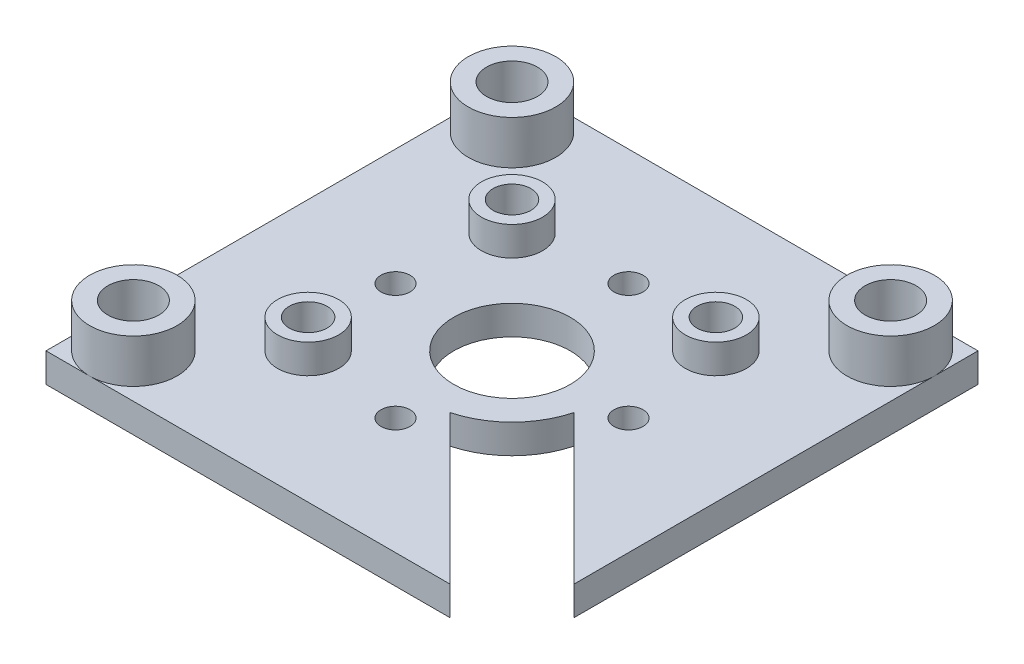
ISO-10303-21;
HEADER;
FILE_DESCRIPTION(('STEP AP214'),'2;1');
FILE_NAME('part.step','',(''),(''),'','','');
FILE_SCHEMA(('AUTOMOTIVE_DESIGN { 1 0 10303 214 1 1 1 1 }'));
ENDSEC;
DATA;
#1=APPLICATION_CONTEXT('core data for automotive mechanical design processes');
#2=APPLICATION_PROTOCOL_DEFINITION('international standard','automotive_design',2000,#1);
#3=PRODUCT_CONTEXT('',#1,'mechanical');
#4=PRODUCT('Part','Part','',(#3));
#5=PRODUCT_RELATED_PRODUCT_CATEGORY('part','',(#4));
#6=PRODUCT_DEFINITION_FORMATION('','',#4);
#7=PRODUCT_DEFINITION_CONTEXT('part definition',#1,'design');
#8=PRODUCT_DEFINITION('design','',#6,#7);
#9=PRODUCT_DEFINITION_SHAPE('','',#8);
#10=(LENGTH_UNIT() NAMED_UNIT(*) SI_UNIT(.MILLI.,.METRE.));
#11=(NAMED_UNIT(*) PLANE_ANGLE_UNIT() SI_UNIT($,.RADIAN.));
#12=(NAMED_UNIT(*) SI_UNIT($,.STERADIAN.) SOLID_ANGLE_UNIT());
#13=UNCERTAINTY_MEASURE_WITH_UNIT(LENGTH_MEASURE(1.E-05),#10,'distance_accuracy_value','');
#14=(GEOMETRIC_REPRESENTATION_CONTEXT(3) GLOBAL_UNCERTAINTY_ASSIGNED_CONTEXT((#13)) GLOBAL_UNIT_ASSIGNED_CONTEXT((#10,
#11,#12)) REPRESENTATION_CONTEXT('',''));
#15=CARTESIAN_POINT('',(0.,0.,0.));
#16=DIRECTION('',(0.,0.,1.));
#17=DIRECTION('',(1.,0.,0.));
#18=AXIS2_PLACEMENT_3D('',#15,#16,#17);
#19=CARTESIAN_POINT('',(0.,2.,0.));
#20=DIRECTION('',(0.,1.,0.));
#21=DIRECTION('',(0.,0.,1.));
#22=AXIS2_PLACEMENT_3D('',#19,#20,#21);
#23=PLANE('',#22);
#24=CARTESIAN_POINT('',(-13.,2.,13.));
#25=DIRECTION('',(0.,1.,0.));
#26=DIRECTION('',(0.,0.,1.));
#27=AXIS2_PLACEMENT_3D('',#24,#25,#26);
#28=CIRCLE('',#27,3.);
#29=CARTESIAN_POINT('',(-13.,2.,16.));
#30=VERTEX_POINT('',#29);
#31=CARTESIAN_POINT('',(-16.,2.,13.));
#32=VERTEX_POINT('',#31);
#33=EDGE_CURVE('E11',#30,#32,#28,.T.);
#34=ORIENTED_EDGE('',*,*,#33,.F.);
#35=DIRECTION('',(1.,0.,0.));
#36=VECTOR('',#35,1.);
#37=CARTESIAN_POINT('',(0.,2.,16.));
#38=LINE('',#37,#36);
#39=CARTESIAN_POINT('',(11.7573593128807,2.,16.));
#40=VERTEX_POINT('',#39);
#41=EDGE_CURVE('E179',#30,#40,#38,.T.);
#42=ORIENTED_EDGE('',*,*,#41,.T.);
#43=DIRECTION('',(0.707106781186548,0.,0.707106781186548));
#44=VECTOR('',#43,1.);
#45=CARTESIAN_POINT('',(-2.12132034355964,2.,2.12132034355964));
#46=LINE('',#45,#44);
#47=CARTESIAN_POINT('',(1.55291427061513,2.,5.79555495773441));
#48=VERTEX_POINT('',#47);
#49=EDGE_CURVE('E381',#48,#40,#46,.T.);
#50=ORIENTED_EDGE('',*,*,#49,.F.);
#51=CARTESIAN_POINT('',(0.,2.,0.));
#52=DIRECTION('',(0.,1.,0.));
#53=DIRECTION('',(0.,0.,1.));
#54=AXIS2_PLACEMENT_3D('',#51,#52,#53);
#55=CIRCLE('',#54,6.00000000000001);
#56=CARTESIAN_POINT('',(5.79555495773441,2.,1.55291427061513));
#57=VERTEX_POINT('',#56);
#58=EDGE_CURVE('E389',#57,#48,#55,.F.);
#59=ORIENTED_EDGE('',*,*,#58,.F.);
#60=DIRECTION('',(0.707106781186548,0.,0.707106781186548));
#61=VECTOR('',#60,1.);
#62=CARTESIAN_POINT('',(2.12132034355964,2.,-2.12132034355964));
#63=LINE('',#62,#61);
#64=CARTESIAN_POINT('',(16.,2.,11.7573593128807));
#65=VERTEX_POINT('',#64);
#66=EDGE_CURVE('E149',#57,#65,#63,.T.);
#67=ORIENTED_EDGE('',*,*,#66,.T.);
#68=DIRECTION('',(0.,0.,1.));
#69=VECTOR('',#68,1.);
#70=CARTESIAN_POINT('',(16.,2.,0.));
#71=LINE('',#70,#69);
#72=CARTESIAN_POINT('',(16.,2.,-13.));
#73=VERTEX_POINT('',#72);
#74=EDGE_CURVE('E130',#73,#65,#71,.T.);
#75=ORIENTED_EDGE('',*,*,#74,.F.);
#76=CARTESIAN_POINT('',(13.,2.,-13.));
#77=DIRECTION('',(0.,1.,0.));
#78=DIRECTION('',(0.,0.,1.));
#79=AXIS2_PLACEMENT_3D('',#76,#77,#78);
#80=CIRCLE('',#79,3.);
#81=CARTESIAN_POINT('',(13.,2.,-16.));
#82=VERTEX_POINT('',#81);
#83=EDGE_CURVE('E143',#82,#73,#80,.T.);
#84=ORIENTED_EDGE('',*,*,#83,.F.);
#85=DIRECTION('',(1.,0.,0.));
#86=VECTOR('',#85,1.);
#87=CARTESIAN_POINT('',(0.,2.,-16.));
#88=LINE('',#87,#86);
#89=CARTESIAN_POINT('',(-13.,2.,-16.));
#90=VERTEX_POINT('',#89);
#91=EDGE_CURVE('E750',#90,#82,#88,.T.);
#92=ORIENTED_EDGE('',*,*,#91,.F.);
#93=CARTESIAN_POINT('',(-13.,2.,-13.));
#94=DIRECTION('',(0.,1.,0.));
#95=DIRECTION('',(0.,0.,1.));
#96=AXIS2_PLACEMENT_3D('',#93,#94,#95);
#97=CIRCLE('',#96,3.);
#98=CARTESIAN_POINT('',(-16.,2.,-13.));
#99=VERTEX_POINT('',#98);
#100=EDGE_CURVE('E67',#99,#90,#97,.T.);
#101=ORIENTED_EDGE('',*,*,#100,.F.);
#102=DIRECTION('',(0.,0.,1.));
#103=VECTOR('',#102,1.);
#104=CARTESIAN_POINT('',(-16.,2.,0.));
#105=LINE('',#104,#103);
#106=EDGE_CURVE('E185',#99,#32,#105,.T.);
#107=ORIENTED_EDGE('',*,*,#106,.T.);
#108=EDGE_LOOP('',(#34,#42,#50,#59,#67,#75,#84,#92,#101,#107));
#109=FACE_BOUND('',#108,.T.);
#110=CARTESIAN_POINT('',(-6.99999999999999,2.,7.00000000000002));
#111=DIRECTION('',(0.,1.,0.));
#112=DIRECTION('',(0.,0.,1.));
#113=AXIS2_PLACEMENT_3D('',#110,#111,#112);
#114=CIRCLE('',#113,2.1);
#115=CARTESIAN_POINT('',(-6.99999999999999,2.,9.10000000000002));
#116=VERTEX_POINT('',#115);
#117=EDGE_CURVE('E163',#116,#116,#114,.T.);
#118=ORIENTED_EDGE('',*,*,#117,.F.);
#119=EDGE_LOOP('',(#118));
#120=FACE_BOUND('',#119,.T.);
#121=CARTESIAN_POINT('',(-7.00000000000001,2.,-6.99999999999999));
#122=DIRECTION('',(0.,1.,0.));
#123=DIRECTION('',(0.,0.,1.));
#124=AXIS2_PLACEMENT_3D('',#121,#122,#123);
#125=CIRCLE('',#124,2.1);
#126=CARTESIAN_POINT('',(-7.00000000000001,2.,-4.89999999999999));
#127=VERTEX_POINT('',#126);
#128=EDGE_CURVE('E165',#127,#127,#125,.T.);
#129=ORIENTED_EDGE('',*,*,#128,.F.);
#130=EDGE_LOOP('',(#129));
#131=FACE_BOUND('',#130,.T.);
#132=CARTESIAN_POINT('',(6.99999999999999,2.,-7.00000000000002));
#133=DIRECTION('',(0.,1.,0.));
#134=DIRECTION('',(0.,0.,1.));
#135=AXIS2_PLACEMENT_3D('',#132,#133,#134);
#136=CIRCLE('',#135,2.1);
#137=CARTESIAN_POINT('',(6.99999999999999,2.,-4.90000000000002));
#138=VERTEX_POINT('',#137);
#139=EDGE_CURVE('E252',#138,#138,#136,.T.);
#140=ORIENTED_EDGE('',*,*,#139,.F.);
#141=EDGE_LOOP('',(#140));
#142=FACE_BOUND('',#141,.T.);
#143=CARTESIAN_POINT('',(0.,2.,0.));
#144=DIRECTION('',(0.,1.,0.));
#145=DIRECTION('',(0.,0.,1.));
#146=AXIS2_PLACEMENT_3D('',#143,#144,#145);
#147=CIRCLE('',#146,4.);
#148=CARTESIAN_POINT('',(0.,2.,4.));
#149=VERTEX_POINT('',#148);
#150=EDGE_CURVE('E242',#149,#149,#147,.T.);
#151=ORIENTED_EDGE('',*,*,#150,.F.);
#152=EDGE_LOOP('',(#151));
#153=FACE_BOUND('',#152,.T.);
#154=CARTESIAN_POINT('',(0.,2.,-8.));
#155=DIRECTION('',(0.,1.,0.));
#156=DIRECTION('',(0.,0.,1.));
#157=AXIS2_PLACEMENT_3D('',#154,#155,#156);
#158=CIRCLE('',#157,1.);
#159=CARTESIAN_POINT('',(0.,2.,-7.));
#160=VERTEX_POINT('',#159);
#161=EDGE_CURVE('E268',#160,#160,#158,.T.);
#162=ORIENTED_EDGE('',*,*,#161,.F.);
#163=EDGE_LOOP('',(#162));
#164=FACE_BOUND('',#163,.T.);
#165=CARTESIAN_POINT('',(-8.,2.,0.));
#166=DIRECTION('',(0.,1.,0.));
#167=DIRECTION('',(0.,0.,1.));
#168=AXIS2_PLACEMENT_3D('',#165,#166,#167);
#169=CIRCLE('',#168,1.);
#170=CARTESIAN_POINT('',(-8.,2.,0.999999999999944));
#171=VERTEX_POINT('',#170);
#172=EDGE_CURVE('E271',#171,#171,#169,.T.);
#173=ORIENTED_EDGE('',*,*,#172,.F.);
#174=EDGE_LOOP('',(#173));
#175=FACE_BOUND('',#174,.T.);
#176=CARTESIAN_POINT('',(0.,2.,8.));
#177=DIRECTION('',(0.,1.,0.));
#178=DIRECTION('',(0.,0.,1.));
#179=AXIS2_PLACEMENT_3D('',#176,#177,#178);
#180=CIRCLE('',#179,1.);
#181=CARTESIAN_POINT('',(0.,2.,9.));
#182=VERTEX_POINT('',#181);
#183=EDGE_CURVE('E277',#182,#182,#180,.T.);
#184=ORIENTED_EDGE('',*,*,#183,.F.);
#185=EDGE_LOOP('',(#184));
#186=FACE_BOUND('',#185,.T.);
#187=CARTESIAN_POINT('',(8.,2.,0.));
#188=DIRECTION('',(0.,1.,0.));
#189=DIRECTION('',(0.,0.,1.));
#190=AXIS2_PLACEMENT_3D('',#187,#188,#189);
#191=CIRCLE('',#190,1.);
#192=CARTESIAN_POINT('',(8.,2.,1.));
#193=VERTEX_POINT('',#192);
#194=EDGE_CURVE('E150',#193,#193,#191,.T.);
#195=ORIENTED_EDGE('',*,*,#194,.F.);
#196=EDGE_LOOP('',(#195));
#197=FACE_BOUND('',#196,.T.);
#198=ADVANCED_FACE('F50',(#109,#120,#131,#142,#153,#164,#175,#186,#197),#23,.T.);
#199=EDGE_CURVE('E169',#90,#99,#97,.T.);
#200=ORIENTED_EDGE('',*,*,#199,.F.);
#201=CARTESIAN_POINT('',(-16.,2.,-16.));
#202=VERTEX_POINT('',#201);
#203=EDGE_CURVE('E192',#202,#90,#88,.T.);
#204=ORIENTED_EDGE('',*,*,#203,.F.);
#205=EDGE_CURVE('E190',#202,#99,#105,.T.);
#206=ORIENTED_EDGE('',*,*,#205,.T.);
#207=EDGE_LOOP('',(#200,#204,#206));
#208=FACE_BOUND('',#207,.T.);
#209=ADVANCED_FACE('F288',(#208),#23,.T.);
#210=EDGE_CURVE('E151',#73,#82,#80,.T.);
#211=ORIENTED_EDGE('',*,*,#210,.F.);
#212=CARTESIAN_POINT('',(16.,2.,-16.));
#213=VERTEX_POINT('',#212);
#214=EDGE_CURVE('E126',#213,#73,#71,.T.);
#215=ORIENTED_EDGE('',*,*,#214,.F.);
#216=EDGE_CURVE('E138',#82,#213,#88,.T.);
#217=ORIENTED_EDGE('',*,*,#216,.F.);
#218=EDGE_LOOP('',(#211,#215,#217));
#219=FACE_BOUND('',#218,.T.);
#220=ADVANCED_FACE('F155',(#219),#23,.T.);
#221=CARTESIAN_POINT('',(0.,0.,0.));
#222=DIRECTION('',(0.,1.,0.));
#223=DIRECTION('',(0.,0.,1.));
#224=AXIS2_PLACEMENT_3D('',#221,#222,#223);
#225=PLANE('',#224);
#226=CARTESIAN_POINT('',(13.,0.,-13.));
#227=DIRECTION('',(0.,1.,0.));
#228=DIRECTION('',(0.,0.,1.));
#229=AXIS2_PLACEMENT_3D('',#226,#227,#228);
#230=CIRCLE('',#229,1.75);
#231=CARTESIAN_POINT('',(13.,0.,-11.25));
#232=VERTEX_POINT('',#231);
#233=EDGE_CURVE('E206',#232,#232,#230,.T.);
#234=ORIENTED_EDGE('',*,*,#233,.T.);
#235=EDGE_LOOP('',(#234));
#236=FACE_BOUND('',#235,.T.);
#237=DIRECTION('',(1.,0.,0.));
#238=VECTOR('',#237,1.);
#239=CARTESIAN_POINT('',(0.,0.,-16.));
#240=LINE('',#239,#238);
#241=CARTESIAN_POINT('',(-16.,0.,-16.));
#242=VERTEX_POINT('',#241);
#243=CARTESIAN_POINT('',(16.,0.,-16.));
#244=VERTEX_POINT('',#243);
#245=EDGE_CURVE('E232',#242,#244,#240,.T.);
#246=ORIENTED_EDGE('',*,*,#245,.T.);
#247=DIRECTION('',(0.,0.,1.));
#248=VECTOR('',#247,1.);
#249=CARTESIAN_POINT('',(16.,0.,0.));
#250=LINE('',#249,#248);
#251=CARTESIAN_POINT('',(16.,0.,11.7573593128807));
#252=VERTEX_POINT('',#251);
#253=EDGE_CURVE('E235',#244,#252,#250,.T.);
#254=ORIENTED_EDGE('',*,*,#253,.T.);
#255=DIRECTION('',(-0.707106781186548,0.,-0.707106781186548));
#256=VECTOR('',#255,1.);
#257=CARTESIAN_POINT('',(2.12132034355964,0.,-2.12132034355964));
#258=LINE('',#257,#256);
#259=CARTESIAN_POINT('',(5.79555495773441,0.,1.55291427061513));
#260=VERTEX_POINT('',#259);
#261=EDGE_CURVE('E414',#252,#260,#258,.T.);
#262=ORIENTED_EDGE('',*,*,#261,.T.);
#263=CARTESIAN_POINT('',(0.,0.,0.));
#264=DIRECTION('',(0.,1.,0.));
#265=DIRECTION('',(0.,0.,1.));
#266=AXIS2_PLACEMENT_3D('',#263,#264,#265);
#267=CIRCLE('',#266,6.00000000000001);
#268=CARTESIAN_POINT('',(1.55291427061513,0.,5.79555495773441));
#269=VERTEX_POINT('',#268);
#270=EDGE_CURVE('E397',#269,#260,#267,.T.);
#271=ORIENTED_EDGE('',*,*,#270,.F.);
#272=DIRECTION('',(-0.707106781186548,0.,-0.707106781186548));
#273=VECTOR('',#272,1.);
#274=CARTESIAN_POINT('',(-2.12132034355964,0.,2.12132034355964));
#275=LINE('',#274,#273);
#276=CARTESIAN_POINT('',(11.7573593128807,0.,16.));
#277=VERTEX_POINT('',#276);
#278=EDGE_CURVE('E387',#277,#269,#275,.T.);
#279=ORIENTED_EDGE('',*,*,#278,.F.);
#280=DIRECTION('',(1.,0.,0.));
#281=VECTOR('',#280,1.);
#282=CARTESIAN_POINT('',(0.,0.,16.));
#283=LINE('',#282,#281);
#284=CARTESIAN_POINT('',(-16.,0.,16.));
#285=VERTEX_POINT('',#284);
#286=EDGE_CURVE('E241',#285,#277,#283,.T.);
#287=ORIENTED_EDGE('',*,*,#286,.F.);
#288=DIRECTION('',(0.,0.,1.));
#289=VECTOR('',#288,1.);
#290=CARTESIAN_POINT('',(-16.,0.,0.));
#291=LINE('',#290,#289);
#292=EDGE_CURVE('E238',#242,#285,#291,.T.);
#293=ORIENTED_EDGE('',*,*,#292,.F.);
#294=EDGE_LOOP('',(#246,#254,#262,#271,#279,#287,#293));
#295=FACE_BOUND('',#294,.T.);
#296=CARTESIAN_POINT('',(-6.99999999999999,0.,7.00000000000002));
#297=DIRECTION('',(0.,1.,0.));
#298=DIRECTION('',(0.,0.,1.));
#299=AXIS2_PLACEMENT_3D('',#296,#297,#298);
#300=CIRCLE('',#299,1.3);
#301=CARTESIAN_POINT('',(-6.99999999999999,0.,8.30000000000002));
#302=VERTEX_POINT('',#301);
#303=EDGE_CURVE('E419',#302,#302,#300,.F.);
#304=ORIENTED_EDGE('',*,*,#303,.F.);
#305=EDGE_LOOP('',(#304));
#306=FACE_BOUND('',#305,.T.);
#307=CARTESIAN_POINT('',(6.99999999999999,0.,-7.00000000000002));
#308=DIRECTION('',(0.,1.,0.));
#309=DIRECTION('',(0.,0.,1.));
#310=AXIS2_PLACEMENT_3D('',#307,#308,#309);
#311=CIRCLE('',#310,1.3);
#312=CARTESIAN_POINT('',(6.99999999999999,0.,-5.70000000000002));
#313=VERTEX_POINT('',#312);
#314=EDGE_CURVE('E400',#313,#313,#311,.F.);
#315=ORIENTED_EDGE('',*,*,#314,.F.);
#316=EDGE_LOOP('',(#315));
#317=FACE_BOUND('',#316,.T.);
#318=CARTESIAN_POINT('',(-7.00000000000001,0.,-6.99999999999999));
#319=DIRECTION('',(0.,1.,0.));
#320=DIRECTION('',(0.,0.,1.));
#321=AXIS2_PLACEMENT_3D('',#318,#319,#320);
#322=CIRCLE('',#321,1.3);
#323=CARTESIAN_POINT('',(-7.00000000000001,0.,-5.69999999999999));
#324=VERTEX_POINT('',#323);
#325=EDGE_CURVE('E422',#324,#324,#322,.F.);
#326=ORIENTED_EDGE('',*,*,#325,.F.);
#327=EDGE_LOOP('',(#326));
#328=FACE_BOUND('',#327,.T.);
#329=CARTESIAN_POINT('',(0.,0.,0.));
#330=DIRECTION('',(0.,1.,0.));
#331=DIRECTION('',(0.,0.,1.));
#332=AXIS2_PLACEMENT_3D('',#329,#330,#331);
#333=CIRCLE('',#332,4.);
#334=CARTESIAN_POINT('',(0.,0.,4.));
#335=VERTEX_POINT('',#334);
#336=EDGE_CURVE('E212',#335,#335,#333,.T.);
#337=ORIENTED_EDGE('',*,*,#336,.T.);
#338=EDGE_LOOP('',(#337));
#339=FACE_BOUND('',#338,.T.);
#340=CARTESIAN_POINT('',(0.,0.,-8.));
#341=DIRECTION('',(0.,1.,0.));
#342=DIRECTION('',(0.,0.,1.));
#343=AXIS2_PLACEMENT_3D('',#340,#341,#342);
#344=CIRCLE('',#343,1.);
#345=CARTESIAN_POINT('',(0.,0.,-7.));
#346=VERTEX_POINT('',#345);
#347=EDGE_CURVE('E219',#346,#346,#344,.T.);
#348=ORIENTED_EDGE('',*,*,#347,.T.);
#349=EDGE_LOOP('',(#348));
#350=FACE_BOUND('',#349,.T.);
#351=CARTESIAN_POINT('',(-8.,0.,0.));
#352=DIRECTION('',(0.,1.,0.));
#353=DIRECTION('',(0.,0.,1.));
#354=AXIS2_PLACEMENT_3D('',#351,#352,#353);
#355=CIRCLE('',#354,1.);
#356=CARTESIAN_POINT('',(-8.,0.,0.999999999999944));
#357=VERTEX_POINT('',#356);
#358=EDGE_CURVE('E217',#357,#357,#355,.T.);
#359=ORIENTED_EDGE('',*,*,#358,.T.);
#360=EDGE_LOOP('',(#359));
#361=FACE_BOUND('',#360,.T.);
#362=CARTESIAN_POINT('',(0.,0.,8.));
#363=DIRECTION('',(0.,1.,0.));
#364=DIRECTION('',(0.,0.,1.));
#365=AXIS2_PLACEMENT_3D('',#362,#363,#364);
#366=CIRCLE('',#365,1.);
#367=CARTESIAN_POINT('',(0.,0.,9.));
#368=VERTEX_POINT('',#367);
#369=EDGE_CURVE('E223',#368,#368,#366,.T.);
#370=ORIENTED_EDGE('',*,*,#369,.T.);
#371=EDGE_LOOP('',(#370));
#372=FACE_BOUND('',#371,.T.);
#373=CARTESIAN_POINT('',(8.,0.,0.));
#374=DIRECTION('',(0.,1.,0.));
#375=DIRECTION('',(0.,0.,1.));
#376=AXIS2_PLACEMENT_3D('',#373,#374,#375);
#377=CIRCLE('',#376,1.);
#378=CARTESIAN_POINT('',(8.,0.,1.));
#379=VERTEX_POINT('',#378);
#380=EDGE_CURVE('E226',#379,#379,#377,.T.);
#381=ORIENTED_EDGE('',*,*,#380,.T.);
#382=EDGE_LOOP('',(#381));
#383=FACE_BOUND('',#382,.T.);
#384=CARTESIAN_POINT('',(-13.,0.,-13.));
#385=DIRECTION('',(0.,1.,0.));
#386=DIRECTION('',(0.,0.,1.));
#387=AXIS2_PLACEMENT_3D('',#384,#385,#386);
#388=CIRCLE('',#387,1.75);
#389=CARTESIAN_POINT('',(-13.,0.,-11.25));
#390=VERTEX_POINT('',#389);
#391=EDGE_CURVE('E204',#390,#390,#388,.F.);
#392=ORIENTED_EDGE('',*,*,#391,.F.);
#393=EDGE_LOOP('',(#392));
#394=FACE_BOUND('',#393,.T.);
#395=CARTESIAN_POINT('',(-13.,0.,13.));
#396=DIRECTION('',(0.,1.,0.));
#397=DIRECTION('',(0.,0.,1.));
#398=AXIS2_PLACEMENT_3D('',#395,#396,#397);
#399=CIRCLE('',#398,1.75);
#400=CARTESIAN_POINT('',(-13.,0.,14.75));
#401=VERTEX_POINT('',#400);
#402=EDGE_CURVE('E198',#401,#401,#399,.T.);
#403=ORIENTED_EDGE('',*,*,#402,.T.);
#404=EDGE_LOOP('',(#403));
#405=FACE_BOUND('',#404,.T.);
#406=ADVANCED_FACE('F311',(#236,#295,#306,#317,#328,#339,#350,#361,#372,#383,#394,#405),#225,.F.);
#407=CARTESIAN_POINT('',(16.,2.,0.));
#408=DIRECTION('',(1.,0.,0.));
#409=DIRECTION('',(0.,0.,-1.));
#410=AXIS2_PLACEMENT_3D('',#407,#408,#409);
#411=PLANE('',#410);
#412=DIRECTION('',(0.,1.,0.));
#413=VECTOR('',#412,1.);
#414=CARTESIAN_POINT('',(16.,-20.4312645752629,11.7573593128807));
#415=LINE('',#414,#413);
#416=EDGE_CURVE('E392',#252,#65,#415,.T.);
#417=ORIENTED_EDGE('',*,*,#416,.F.);
#418=ORIENTED_EDGE('',*,*,#253,.F.);
#419=DIRECTION('',(0.,-1.,0.));
#420=VECTOR('',#419,1.);
#421=CARTESIAN_POINT('',(16.,2.,-16.));
#422=LINE('',#421,#420);
#423=EDGE_CURVE('E133',#213,#244,#422,.T.);
#424=ORIENTED_EDGE('',*,*,#423,.F.);
#425=ORIENTED_EDGE('',*,*,#214,.T.);
#426=ORIENTED_EDGE('',*,*,#74,.T.);
#427=EDGE_LOOP('',(#417,#418,#424,#425,#426));
#428=FACE_BOUND('',#427,.T.);
#429=ADVANCED_FACE('F128',(#428),#411,.T.);
#430=CARTESIAN_POINT('',(0.,2.,-16.));
#431=DIRECTION('',(0.,0.,-1.));
#432=DIRECTION('',(-1.,0.,0.));
#433=AXIS2_PLACEMENT_3D('',#430,#431,#432);
#434=PLANE('',#433);
#435=ORIENTED_EDGE('',*,*,#423,.T.);
#436=ORIENTED_EDGE('',*,*,#245,.F.);
#437=DIRECTION('',(0.,-1.,0.));
#438=VECTOR('',#437,1.);
#439=CARTESIAN_POINT('',(-16.,2.,-16.));
#440=LINE('',#439,#438);
#441=EDGE_CURVE('E250',#202,#242,#440,.T.);
#442=ORIENTED_EDGE('',*,*,#441,.F.);
#443=ORIENTED_EDGE('',*,*,#203,.T.);
#444=ORIENTED_EDGE('',*,*,#91,.T.);
#445=ORIENTED_EDGE('',*,*,#216,.T.);
#446=EDGE_LOOP('',(#435,#436,#442,#443,#444,#445));
#447=FACE_BOUND('',#446,.T.);
#448=ADVANCED_FACE('F316',(#447),#434,.T.);
#449=CARTESIAN_POINT('',(-16.,2.,0.));
#450=DIRECTION('',(1.,0.,0.));
#451=DIRECTION('',(0.,0.,-1.));
#452=AXIS2_PLACEMENT_3D('',#449,#450,#451);
#453=PLANE('',#452);
#454=CARTESIAN_POINT('',(-16.,2.,16.));
#455=VERTEX_POINT('',#454);
#456=EDGE_CURVE('E189',#32,#455,#105,.T.);
#457=ORIENTED_EDGE('',*,*,#456,.F.);
#458=ORIENTED_EDGE('',*,*,#106,.F.);
#459=ORIENTED_EDGE('',*,*,#205,.F.);
#460=ORIENTED_EDGE('',*,*,#441,.T.);
#461=ORIENTED_EDGE('',*,*,#292,.T.);
#462=DIRECTION('',(0.,-1.,0.));
#463=VECTOR('',#462,1.);
#464=CARTESIAN_POINT('',(-16.,2.,16.));
#465=LINE('',#464,#463);
#466=EDGE_CURVE('E200',#455,#285,#465,.T.);
#467=ORIENTED_EDGE('',*,*,#466,.F.);
#468=EDGE_LOOP('',(#457,#458,#459,#460,#461,#467));
#469=FACE_BOUND('',#468,.T.);
#470=ADVANCED_FACE('F329',(#469),#453,.F.);
#471=CARTESIAN_POINT('',(0.,2.,16.));
#472=DIRECTION('',(0.,0.,-1.));
#473=DIRECTION('',(-1.,0.,0.));
#474=AXIS2_PLACEMENT_3D('',#471,#472,#473);
#475=PLANE('',#474);
#476=ORIENTED_EDGE('',*,*,#41,.F.);
#477=EDGE_CURVE('E195',#455,#30,#38,.T.);
#478=ORIENTED_EDGE('',*,*,#477,.F.);
#479=ORIENTED_EDGE('',*,*,#466,.T.);
#480=ORIENTED_EDGE('',*,*,#286,.T.);
#481=DIRECTION('',(0.,1.,0.));
#482=VECTOR('',#481,1.);
#483=CARTESIAN_POINT('',(11.7573593128807,-20.4312645752629,16.));
#484=LINE('',#483,#482);
#485=EDGE_CURVE('E401',#277,#40,#484,.T.);
#486=ORIENTED_EDGE('',*,*,#485,.T.);
#487=EDGE_LOOP('',(#476,#478,#479,#480,#486));
#488=FACE_BOUND('',#487,.T.);
#489=ADVANCED_FACE('F324',(#488),#475,.F.);
#490=CARTESIAN_POINT('',(8.,2.,0.));
#491=DIRECTION('',(0.,-1.,0.));
#492=DIRECTION('',(0.,0.,-1.));
#493=AXIS2_PLACEMENT_3D('',#490,#491,#492);
#494=CYLINDRICAL_SURFACE('',#493,1.);
#495=ORIENTED_EDGE('',*,*,#194,.T.);
#496=EDGE_LOOP('',(#495));
#497=FACE_BOUND('',#496,.T.);
#498=ORIENTED_EDGE('',*,*,#380,.F.);
#499=EDGE_LOOP('',(#498));
#500=FACE_BOUND('',#499,.T.);
#501=ADVANCED_FACE('F282',(#497,#500),#494,.F.);
#502=CARTESIAN_POINT('',(0.,2.,8.));
#503=DIRECTION('',(0.,-1.,0.));
#504=DIRECTION('',(0.,0.,-1.));
#505=AXIS2_PLACEMENT_3D('',#502,#503,#504);
#506=CYLINDRICAL_SURFACE('',#505,1.);
#507=ORIENTED_EDGE('',*,*,#183,.T.);
#508=EDGE_LOOP('',(#507));
#509=FACE_BOUND('',#508,.T.);
#510=ORIENTED_EDGE('',*,*,#369,.F.);
#511=EDGE_LOOP('',(#510));
#512=FACE_BOUND('',#511,.T.);
#513=ADVANCED_FACE('F333',(#509,#512),#506,.F.);
#514=CARTESIAN_POINT('',(-8.,2.,0.));
#515=DIRECTION('',(0.,-1.,0.));
#516=DIRECTION('',(0.,0.,-1.));
#517=AXIS2_PLACEMENT_3D('',#514,#515,#516);
#518=CYLINDRICAL_SURFACE('',#517,1.);
#519=ORIENTED_EDGE('',*,*,#172,.T.);
#520=EDGE_LOOP('',(#519));
#521=FACE_BOUND('',#520,.T.);
#522=ORIENTED_EDGE('',*,*,#358,.F.);
#523=EDGE_LOOP('',(#522));
#524=FACE_BOUND('',#523,.T.);
#525=ADVANCED_FACE('F340',(#521,#524),#518,.F.);
#526=CARTESIAN_POINT('',(0.,2.,-8.));
#527=DIRECTION('',(0.,-1.,0.));
#528=DIRECTION('',(0.,0.,-1.));
#529=AXIS2_PLACEMENT_3D('',#526,#527,#528);
#530=CYLINDRICAL_SURFACE('',#529,1.);
#531=ORIENTED_EDGE('',*,*,#161,.T.);
#532=EDGE_LOOP('',(#531));
#533=FACE_BOUND('',#532,.T.);
#534=ORIENTED_EDGE('',*,*,#347,.F.);
#535=EDGE_LOOP('',(#534));
#536=FACE_BOUND('',#535,.T.);
#537=ADVANCED_FACE('F341',(#533,#536),#530,.F.);
#538=CARTESIAN_POINT('',(0.,2.,0.));
#539=DIRECTION('',(0.,-1.,0.));
#540=DIRECTION('',(0.,0.,-1.));
#541=AXIS2_PLACEMENT_3D('',#538,#539,#540);
#542=CYLINDRICAL_SURFACE('',#541,4.);
#543=ORIENTED_EDGE('',*,*,#150,.T.);
#544=EDGE_LOOP('',(#543));
#545=FACE_BOUND('',#544,.T.);
#546=ORIENTED_EDGE('',*,*,#336,.F.);
#547=EDGE_LOOP('',(#546));
#548=FACE_BOUND('',#547,.T.);
#549=ADVANCED_FACE('F345',(#545,#548),#542,.F.);
#550=CARTESIAN_POINT('',(13.,2.,-13.));
#551=DIRECTION('',(0.,-1.,0.));
#552=DIRECTION('',(0.,0.,-1.));
#553=AXIS2_PLACEMENT_3D('',#550,#551,#552);
#554=CYLINDRICAL_SURFACE('',#553,1.75);
#555=ORIENTED_EDGE('',*,*,#233,.F.);
#556=EDGE_LOOP('',(#555));
#557=FACE_BOUND('',#556,.T.);
#558=CARTESIAN_POINT('',(13.,5.,-13.));
#559=DIRECTION('',(0.,-1.,0.));
#560=DIRECTION('',(0.,0.,-1.));
#561=AXIS2_PLACEMENT_3D('',#558,#559,#560);
#562=CIRCLE('',#561,1.75);
#563=CARTESIAN_POINT('',(13.,5.,-14.75));
#564=VERTEX_POINT('',#563);
#565=EDGE_CURVE('E373',#564,#564,#562,.T.);
#566=ORIENTED_EDGE('',*,*,#565,.F.);
#567=EDGE_LOOP('',(#566));
#568=FACE_BOUND('',#567,.T.);
#569=ADVANCED_FACE('F348',(#557,#568),#554,.F.);
#570=CARTESIAN_POINT('',(-13.,2.,-13.));
#571=DIRECTION('',(0.,-1.,0.));
#572=DIRECTION('',(0.,0.,-1.));
#573=AXIS2_PLACEMENT_3D('',#570,#571,#572);
#574=CYLINDRICAL_SURFACE('',#573,1.75);
#575=ORIENTED_EDGE('',*,*,#391,.T.);
#576=EDGE_LOOP('',(#575));
#577=FACE_BOUND('',#576,.T.);
#578=CARTESIAN_POINT('',(-13.,5.,-13.));
#579=DIRECTION('',(0.,-1.,0.));
#580=DIRECTION('',(0.,0.,1.));
#581=AXIS2_PLACEMENT_3D('',#578,#579,#580);
#582=CIRCLE('',#581,1.75);
#583=CARTESIAN_POINT('',(-13.,5.,-11.25));
#584=VERTEX_POINT('',#583);
#585=EDGE_CURVE('E363',#584,#584,#582,.T.);
#586=ORIENTED_EDGE('',*,*,#585,.F.);
#587=EDGE_LOOP('',(#586));
#588=FACE_BOUND('',#587,.T.);
#589=ADVANCED_FACE('F308',(#577,#588),#574,.F.);
#590=CARTESIAN_POINT('',(-13.,2.,13.));
#591=DIRECTION('',(0.,-1.,0.));
#592=DIRECTION('',(0.,0.,-1.));
#593=AXIS2_PLACEMENT_3D('',#590,#591,#592);
#594=CYLINDRICAL_SURFACE('',#593,1.75);
#595=ORIENTED_EDGE('',*,*,#402,.F.);
#596=EDGE_LOOP('',(#595));
#597=FACE_BOUND('',#596,.T.);
#598=CARTESIAN_POINT('',(-13.,5.,13.));
#599=DIRECTION('',(0.,-1.,0.));
#600=DIRECTION('',(0.,0.,-1.));
#601=AXIS2_PLACEMENT_3D('',#598,#599,#600);
#602=CIRCLE('',#601,1.75);
#603=CARTESIAN_POINT('',(-13.,5.,11.25));
#604=VERTEX_POINT('',#603);
#605=EDGE_CURVE('E364',#604,#604,#602,.T.);
#606=ORIENTED_EDGE('',*,*,#605,.F.);
#607=EDGE_LOOP('',(#606));
#608=FACE_BOUND('',#607,.T.);
#609=ADVANCED_FACE('F47',(#597,#608),#594,.F.);
#610=EDGE_CURVE('E51',#32,#30,#28,.T.);
#611=ORIENTED_EDGE('',*,*,#610,.F.);
#612=ORIENTED_EDGE('',*,*,#456,.T.);
#613=ORIENTED_EDGE('',*,*,#477,.T.);
#614=EDGE_LOOP('',(#611,#612,#613));
#615=FACE_BOUND('',#614,.T.);
#616=ADVANCED_FACE('F293',(#615),#23,.T.);
#617=CARTESIAN_POINT('',(6.99999999999999,4.,-7.00000000000002));
#618=DIRECTION('',(0.,-1.,0.));
#619=DIRECTION('',(0.,0.,-1.));
#620=AXIS2_PLACEMENT_3D('',#617,#618,#619);
#621=CYLINDRICAL_SURFACE('',#620,1.3);
#622=CARTESIAN_POINT('',(6.99999999999999,4.,-7.00000000000002));
#623=DIRECTION('',(0.,1.,0.));
#624=DIRECTION('',(0.,0.,1.));
#625=AXIS2_PLACEMENT_3D('',#622,#623,#624);
#626=CIRCLE('',#625,1.3);
#627=CARTESIAN_POINT('',(6.99999999999999,4.,-5.70000000000002));
#628=VERTEX_POINT('',#627);
#629=EDGE_CURVE('E429',#628,#628,#626,.T.);
#630=ORIENTED_EDGE('',*,*,#629,.T.);
#631=EDGE_LOOP('',(#630));
#632=FACE_BOUND('',#631,.T.);
#633=ORIENTED_EDGE('',*,*,#314,.T.);
#634=EDGE_LOOP('',(#633));
#635=FACE_BOUND('',#634,.T.);
#636=ADVANCED_FACE('F297',(#632,#635),#621,.F.);
#637=CARTESIAN_POINT('',(6.99999999999999,4.,-7.00000000000002));
#638=DIRECTION('',(0.,-1.,0.));
#639=DIRECTION('',(0.,0.,-1.));
#640=AXIS2_PLACEMENT_3D('',#637,#638,#639);
#641=CYLINDRICAL_SURFACE('',#640,2.1);
#642=CARTESIAN_POINT('',(6.99999999999999,4.,-7.00000000000002));
#643=DIRECTION('',(0.,1.,0.));
#644=DIRECTION('',(0.,0.,1.));
#645=AXIS2_PLACEMENT_3D('',#642,#643,#644);
#646=CIRCLE('',#645,2.1);
#647=CARTESIAN_POINT('',(6.99999999999999,4.,-4.90000000000002));
#648=VERTEX_POINT('',#647);
#649=EDGE_CURVE('E263',#648,#648,#646,.T.);
#650=ORIENTED_EDGE('',*,*,#649,.F.);
#651=EDGE_LOOP('',(#650));
#652=FACE_BOUND('',#651,.T.);
#653=ORIENTED_EDGE('',*,*,#139,.T.);
#654=EDGE_LOOP('',(#653));
#655=FACE_BOUND('',#654,.T.);
#656=ADVANCED_FACE('F306',(#652,#655),#641,.T.);
#657=CARTESIAN_POINT('',(0.,4.,0.));
#658=DIRECTION('',(0.,1.,0.));
#659=DIRECTION('',(0.,0.,1.));
#660=AXIS2_PLACEMENT_3D('',#657,#658,#659);
#661=PLANE('',#660);
#662=ORIENTED_EDGE('',*,*,#629,.F.);
#663=EDGE_LOOP('',(#662));
#664=FACE_BOUND('',#663,.T.);
#665=ORIENTED_EDGE('',*,*,#649,.T.);
#666=EDGE_LOOP('',(#665));
#667=FACE_BOUND('',#666,.T.);
#668=ADVANCED_FACE('F451',(#664,#667),#661,.T.);
#669=CARTESIAN_POINT('',(-7.00000000000001,4.,-6.99999999999999));
#670=DIRECTION('',(0.,-1.,0.));
#671=DIRECTION('',(0.,0.,-1.));
#672=AXIS2_PLACEMENT_3D('',#669,#670,#671);
#673=CYLINDRICAL_SURFACE('',#672,1.3);
#674=CARTESIAN_POINT('',(-7.00000000000001,4.,-6.99999999999999));
#675=DIRECTION('',(0.,1.,0.));
#676=DIRECTION('',(0.,0.,1.));
#677=AXIS2_PLACEMENT_3D('',#674,#675,#676);
#678=CIRCLE('',#677,1.3);
#679=CARTESIAN_POINT('',(-7.00000000000001,4.,-5.69999999999999));
#680=VERTEX_POINT('',#679);
#681=EDGE_CURVE('E438',#680,#680,#678,.T.);
#682=ORIENTED_EDGE('',*,*,#681,.T.);
#683=EDGE_LOOP('',(#682));
#684=FACE_BOUND('',#683,.T.);
#685=ORIENTED_EDGE('',*,*,#325,.T.);
#686=EDGE_LOOP('',(#685));
#687=FACE_BOUND('',#686,.T.);
#688=ADVANCED_FACE('F460',(#684,#687),#673,.F.);
#689=CARTESIAN_POINT('',(-7.00000000000001,4.,-6.99999999999999));
#690=DIRECTION('',(0.,-1.,0.));
#691=DIRECTION('',(0.,0.,-1.));
#692=AXIS2_PLACEMENT_3D('',#689,#690,#691);
#693=CYLINDRICAL_SURFACE('',#692,2.1);
#694=CARTESIAN_POINT('',(-7.00000000000001,4.,-6.99999999999999));
#695=DIRECTION('',(0.,1.,0.));
#696=DIRECTION('',(0.,0.,1.));
#697=AXIS2_PLACEMENT_3D('',#694,#695,#696);
#698=CIRCLE('',#697,2.1);
#699=CARTESIAN_POINT('',(-7.00000000000001,4.,-4.89999999999999));
#700=VERTEX_POINT('',#699);
#701=EDGE_CURVE('E432',#700,#700,#698,.T.);
#702=ORIENTED_EDGE('',*,*,#701,.F.);
#703=EDGE_LOOP('',(#702));
#704=FACE_BOUND('',#703,.T.);
#705=ORIENTED_EDGE('',*,*,#128,.T.);
#706=EDGE_LOOP('',(#705));
#707=FACE_BOUND('',#706,.T.);
#708=ADVANCED_FACE('F463',(#704,#707),#693,.T.);
#709=CARTESIAN_POINT('',(0.,4.,0.));
#710=DIRECTION('',(0.,1.,0.));
#711=DIRECTION('',(0.,0.,1.));
#712=AXIS2_PLACEMENT_3D('',#709,#710,#711);
#713=PLANE('',#712);
#714=ORIENTED_EDGE('',*,*,#681,.F.);
#715=EDGE_LOOP('',(#714));
#716=FACE_BOUND('',#715,.T.);
#717=ORIENTED_EDGE('',*,*,#701,.T.);
#718=EDGE_LOOP('',(#717));
#719=FACE_BOUND('',#718,.T.);
#720=ADVANCED_FACE('F466',(#716,#719),#713,.T.);
#721=CARTESIAN_POINT('',(-6.99999999999999,4.,7.00000000000002));
#722=DIRECTION('',(0.,-1.,0.));
#723=DIRECTION('',(0.,0.,-1.));
#724=AXIS2_PLACEMENT_3D('',#721,#722,#723);
#725=CYLINDRICAL_SURFACE('',#724,1.3);
#726=CARTESIAN_POINT('',(-6.99999999999999,4.,7.00000000000002));
#727=DIRECTION('',(0.,1.,0.));
#728=DIRECTION('',(0.,0.,1.));
#729=AXIS2_PLACEMENT_3D('',#726,#727,#728);
#730=CIRCLE('',#729,1.3);
#731=CARTESIAN_POINT('',(-6.99999999999999,4.,8.30000000000002));
#732=VERTEX_POINT('',#731);
#733=EDGE_CURVE('E427',#732,#732,#730,.T.);
#734=ORIENTED_EDGE('',*,*,#733,.T.);
#735=EDGE_LOOP('',(#734));
#736=FACE_BOUND('',#735,.T.);
#737=ORIENTED_EDGE('',*,*,#303,.T.);
#738=EDGE_LOOP('',(#737));
#739=FACE_BOUND('',#738,.T.);
#740=ADVANCED_FACE('F472',(#736,#739),#725,.F.);
#741=CARTESIAN_POINT('',(-6.99999999999999,4.,7.00000000000002));
#742=DIRECTION('',(0.,-1.,0.));
#743=DIRECTION('',(0.,0.,-1.));
#744=AXIS2_PLACEMENT_3D('',#741,#742,#743);
#745=CYLINDRICAL_SURFACE('',#744,2.1);
#746=CARTESIAN_POINT('',(-6.99999999999999,4.,7.00000000000002));
#747=DIRECTION('',(0.,1.,0.));
#748=DIRECTION('',(0.,0.,1.));
#749=AXIS2_PLACEMENT_3D('',#746,#747,#748);
#750=CIRCLE('',#749,2.1);
#751=CARTESIAN_POINT('',(-6.99999999999999,4.,9.10000000000002));
#752=VERTEX_POINT('',#751);
#753=EDGE_CURVE('E203',#752,#752,#750,.T.);
#754=ORIENTED_EDGE('',*,*,#753,.F.);
#755=EDGE_LOOP('',(#754));
#756=FACE_BOUND('',#755,.T.);
#757=ORIENTED_EDGE('',*,*,#117,.T.);
#758=EDGE_LOOP('',(#757));
#759=FACE_BOUND('',#758,.T.);
#760=ADVANCED_FACE('F479',(#756,#759),#745,.T.);
#761=CARTESIAN_POINT('',(0.,4.,0.));
#762=DIRECTION('',(0.,1.,0.));
#763=DIRECTION('',(0.,0.,1.));
#764=AXIS2_PLACEMENT_3D('',#761,#762,#763);
#765=PLANE('',#764);
#766=ORIENTED_EDGE('',*,*,#733,.F.);
#767=EDGE_LOOP('',(#766));
#768=FACE_BOUND('',#767,.T.);
#769=ORIENTED_EDGE('',*,*,#753,.T.);
#770=EDGE_LOOP('',(#769));
#771=FACE_BOUND('',#770,.T.);
#772=ADVANCED_FACE('F477',(#768,#771),#765,.T.);
#773=CARTESIAN_POINT('',(2.12132034355964,-20.4312645752629,-2.12132034355964));
#774=DIRECTION('',(-0.707106781186547,0.,0.707106781186547));
#775=DIRECTION('',(0.707106781186548,0.,0.707106781186548));
#776=AXIS2_PLACEMENT_3D('',#773,#774,#775);
#777=PLANE('',#776);
#778=ORIENTED_EDGE('',*,*,#416,.T.);
#779=ORIENTED_EDGE('',*,*,#66,.F.);
#780=DIRECTION('',(0.,1.,0.));
#781=VECTOR('',#780,1.);
#782=CARTESIAN_POINT('',(5.79555495773441,-20.4312645752629,1.55291427061513));
#783=LINE('',#782,#781);
#784=EDGE_CURVE('E396',#260,#57,#783,.T.);
#785=ORIENTED_EDGE('',*,*,#784,.F.);
#786=ORIENTED_EDGE('',*,*,#261,.F.);
#787=EDGE_LOOP('',(#778,#779,#785,#786));
#788=FACE_BOUND('',#787,.T.);
#789=ADVANCED_FACE('F483',(#788),#777,.T.);
#790=CARTESIAN_POINT('',(-2.12132034355964,-20.4312645752629,2.12132034355964));
#791=DIRECTION('',(-0.707106781186547,0.,0.707106781186547));
#792=DIRECTION('',(0.707106781186548,0.,0.707106781186548));
#793=AXIS2_PLACEMENT_3D('',#790,#791,#792);
#794=PLANE('',#793);
#795=ORIENTED_EDGE('',*,*,#278,.T.);
#796=DIRECTION('',(0.,1.,0.));
#797=VECTOR('',#796,1.);
#798=CARTESIAN_POINT('',(1.55291427061513,-20.4312645752629,5.79555495773441));
#799=LINE('',#798,#797);
#800=EDGE_CURVE('E391',#269,#48,#799,.T.);
#801=ORIENTED_EDGE('',*,*,#800,.T.);
#802=ORIENTED_EDGE('',*,*,#49,.T.);
#803=ORIENTED_EDGE('',*,*,#485,.F.);
#804=EDGE_LOOP('',(#795,#801,#802,#803));
#805=FACE_BOUND('',#804,.T.);
#806=ADVANCED_FACE('F486',(#805),#794,.F.);
#807=CARTESIAN_POINT('',(0.,-20.4312645752629,0.));
#808=DIRECTION('',(0.,1.,0.));
#809=DIRECTION('',(0.,0.,1.));
#810=AXIS2_PLACEMENT_3D('',#807,#808,#809);
#811=CYLINDRICAL_SURFACE('',#810,6.00000000000001);
#812=ORIENTED_EDGE('',*,*,#270,.T.);
#813=ORIENTED_EDGE('',*,*,#784,.T.);
#814=ORIENTED_EDGE('',*,*,#58,.T.);
#815=ORIENTED_EDGE('',*,*,#800,.F.);
#816=EDGE_LOOP('',(#812,#813,#814,#815));
#817=FACE_BOUND('',#816,.T.);
#818=ADVANCED_FACE('F495',(#817),#811,.T.);
#819=CARTESIAN_POINT('',(13.,5.,-13.));
#820=DIRECTION('',(0.,-1.,0.));
#821=DIRECTION('',(0.,0.,-1.));
#822=AXIS2_PLACEMENT_3D('',#819,#820,#821);
#823=CYLINDRICAL_SURFACE('',#822,3.);
#824=ORIENTED_EDGE('',*,*,#83,.T.);
#825=ORIENTED_EDGE('',*,*,#210,.T.);
#826=EDGE_LOOP('',(#824,#825));
#827=FACE_BOUND('',#826,.T.);
#828=CARTESIAN_POINT('',(13.,5.,-13.));
#829=DIRECTION('',(0.,-1.,0.));
#830=DIRECTION('',(0.,0.,-1.));
#831=AXIS2_PLACEMENT_3D('',#828,#829,#830);
#832=CIRCLE('',#831,3.);
#833=CARTESIAN_POINT('',(13.,5.,-16.));
#834=VERTEX_POINT('',#833);
#835=EDGE_CURVE('E380',#834,#834,#832,.T.);
#836=ORIENTED_EDGE('',*,*,#835,.T.);
#837=EDGE_LOOP('',(#836));
#838=FACE_BOUND('',#837,.T.);
#839=ADVANCED_FACE('F159',(#827,#838),#823,.T.);
#840=CARTESIAN_POINT('',(13.,5.,-13.));
#841=DIRECTION('',(0.,-1.,0.));
#842=DIRECTION('',(0.,0.,-1.));
#843=AXIS2_PLACEMENT_3D('',#840,#841,#842);
#844=PLANE('',#843);
#845=ORIENTED_EDGE('',*,*,#565,.T.);
#846=EDGE_LOOP('',(#845));
#847=FACE_BOUND('',#846,.T.);
#848=ORIENTED_EDGE('',*,*,#835,.F.);
#849=EDGE_LOOP('',(#848));
#850=FACE_BOUND('',#849,.T.);
#851=ADVANCED_FACE('F496',(#847,#850),#844,.F.);
#852=CARTESIAN_POINT('',(-13.,5.,-13.));
#853=DIRECTION('',(0.,-1.,0.));
#854=DIRECTION('',(0.,0.,-1.));
#855=AXIS2_PLACEMENT_3D('',#852,#853,#854);
#856=CYLINDRICAL_SURFACE('',#855,3.);
#857=ORIENTED_EDGE('',*,*,#100,.T.);
#858=ORIENTED_EDGE('',*,*,#199,.T.);
#859=EDGE_LOOP('',(#857,#858));
#860=FACE_BOUND('',#859,.T.);
#861=CARTESIAN_POINT('',(-13.,5.,-13.));
#862=DIRECTION('',(0.,-1.,0.));
#863=DIRECTION('',(0.,0.,1.));
#864=AXIS2_PLACEMENT_3D('',#861,#862,#863);
#865=CIRCLE('',#864,3.);
#866=CARTESIAN_POINT('',(-13.,5.,-10.));
#867=VERTEX_POINT('',#866);
#868=EDGE_CURVE('E362',#867,#867,#865,.T.);
#869=ORIENTED_EDGE('',*,*,#868,.T.);
#870=EDGE_LOOP('',(#869));
#871=FACE_BOUND('',#870,.T.);
#872=ADVANCED_FACE('F497',(#860,#871),#856,.T.);
#873=CARTESIAN_POINT('',(-13.,5.,-13.));
#874=DIRECTION('',(0.,1.,0.));
#875=DIRECTION('',(0.,0.,1.));
#876=AXIS2_PLACEMENT_3D('',#873,#874,#875);
#877=PLANE('',#876);
#878=ORIENTED_EDGE('',*,*,#585,.T.);
#879=EDGE_LOOP('',(#878));
#880=FACE_BOUND('',#879,.T.);
#881=ORIENTED_EDGE('',*,*,#868,.F.);
#882=EDGE_LOOP('',(#881));
#883=FACE_BOUND('',#882,.T.);
#884=ADVANCED_FACE('F505',(#880,#883),#877,.T.);
#885=CARTESIAN_POINT('',(-13.,5.,13.));
#886=DIRECTION('',(0.,-1.,0.));
#887=DIRECTION('',(0.,0.,-1.));
#888=AXIS2_PLACEMENT_3D('',#885,#886,#887);
#889=CYLINDRICAL_SURFACE('',#888,3.);
#890=ORIENTED_EDGE('',*,*,#610,.T.);
#891=ORIENTED_EDGE('',*,*,#33,.T.);
#892=EDGE_LOOP('',(#890,#891));
#893=FACE_BOUND('',#892,.T.);
#894=CARTESIAN_POINT('',(-13.,5.,13.));
#895=DIRECTION('',(0.,-1.,0.));
#896=DIRECTION('',(0.,0.,-1.));
#897=AXIS2_PLACEMENT_3D('',#894,#895,#896);
#898=CIRCLE('',#897,3.);
#899=CARTESIAN_POINT('',(-13.,5.,10.));
#900=VERTEX_POINT('',#899);
#901=EDGE_CURVE('E369',#900,#900,#898,.T.);
#902=ORIENTED_EDGE('',*,*,#901,.T.);
#903=EDGE_LOOP('',(#902));
#904=FACE_BOUND('',#903,.T.);
#905=ADVANCED_FACE('F176',(#893,#904),#889,.T.);
#906=CARTESIAN_POINT('',(-13.,5.,13.));
#907=DIRECTION('',(0.,-1.,0.));
#908=DIRECTION('',(0.,0.,-1.));
#909=AXIS2_PLACEMENT_3D('',#906,#907,#908);
#910=PLANE('',#909);
#911=ORIENTED_EDGE('',*,*,#605,.T.);
#912=EDGE_LOOP('',(#911));
#913=FACE_BOUND('',#912,.T.);
#914=ORIENTED_EDGE('',*,*,#901,.F.);
#915=EDGE_LOOP('',(#914));
#916=FACE_BOUND('',#915,.T.);
#917=ADVANCED_FACE('F508',(#913,#916),#910,.F.);
#918=CLOSED_SHELL('',(#198,#209,#220,#406,#429,#448,#470,#489,#501,#513,#525,#537,#549,#569,
#589,#609,#616,#636,#656,#668,#688,#708,#720,#740,#760,#772,#789,#806,#818,#839,#851,#872,#884,
#905,#917));
#919=MANIFOLD_SOLID_BREP('B2',#918);
#920=ADVANCED_BREP_SHAPE_REPRESENTATION('',(#18,#919),#14);
#921=SHAPE_DEFINITION_REPRESENTATION(#9,#920);
ENDSEC;
END-ISO-10303-21;
